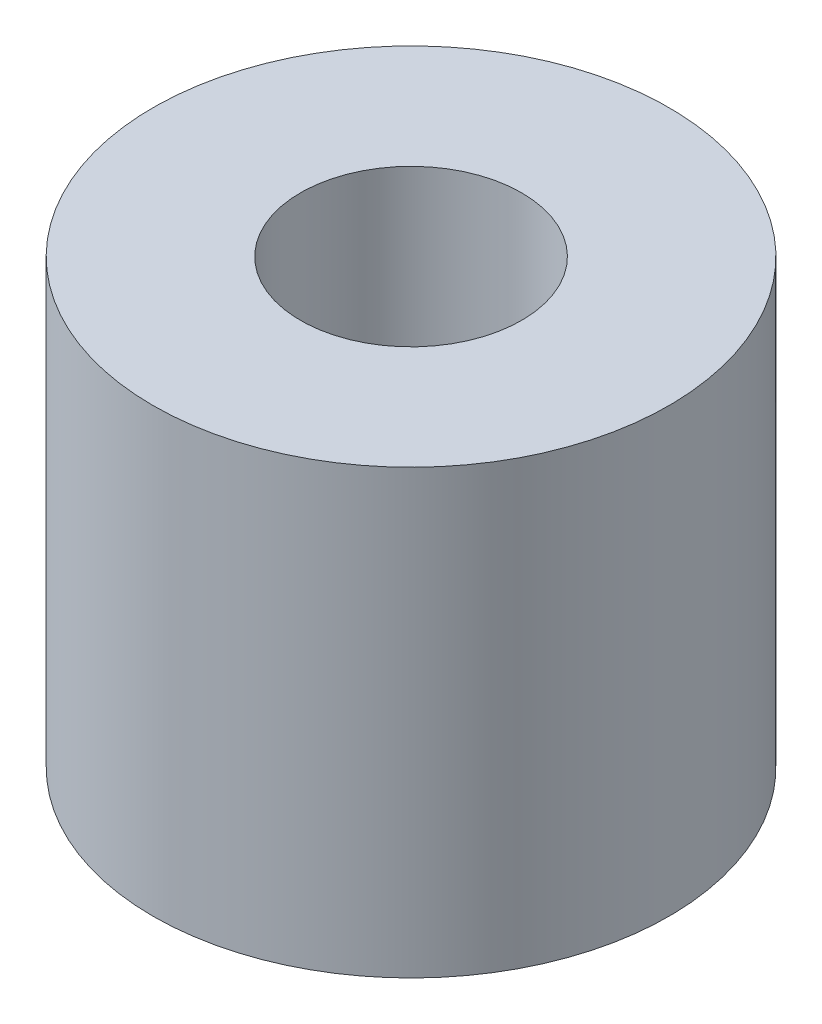
ISO-10303-21;
HEADER;
FILE_DESCRIPTION(('STEP AP214'),'2;1');
FILE_NAME('part.step','',(''),(''),'','','');
FILE_SCHEMA(('AUTOMOTIVE_DESIGN { 1 0 10303 214 1 1 1 1 }'));
ENDSEC;
DATA;
#1=APPLICATION_CONTEXT('core data for automotive mechanical design processes');
#2=APPLICATION_PROTOCOL_DEFINITION('international standard','automotive_design',2000,#1);
#3=PRODUCT_CONTEXT('',#1,'mechanical');
#4=PRODUCT('Part','Part','',(#3));
#5=PRODUCT_RELATED_PRODUCT_CATEGORY('part','',(#4));
#6=PRODUCT_DEFINITION_FORMATION('','',#4);
#7=PRODUCT_DEFINITION_CONTEXT('part definition',#1,'design');
#8=PRODUCT_DEFINITION('design','',#6,#7);
#9=PRODUCT_DEFINITION_SHAPE('','',#8);
#10=(LENGTH_UNIT() NAMED_UNIT(*) SI_UNIT(.MILLI.,.METRE.));
#11=(NAMED_UNIT(*) PLANE_ANGLE_UNIT() SI_UNIT($,.RADIAN.));
#12=(NAMED_UNIT(*) SI_UNIT($,.STERADIAN.) SOLID_ANGLE_UNIT());
#13=UNCERTAINTY_MEASURE_WITH_UNIT(LENGTH_MEASURE(1.E-05),#10,'distance_accuracy_value','');
#14=(GEOMETRIC_REPRESENTATION_CONTEXT(3) GLOBAL_UNCERTAINTY_ASSIGNED_CONTEXT((#13)) GLOBAL_UNIT_ASSIGNED_CONTEXT((#10,
#11,#12)) REPRESENTATION_CONTEXT('',''));
#15=CARTESIAN_POINT('',(0.,0.,0.));
#16=DIRECTION('',(0.,0.,1.));
#17=DIRECTION('',(1.,0.,0.));
#18=AXIS2_PLACEMENT_3D('',#15,#16,#17);
#19=CARTESIAN_POINT('',(0.,30.,0.));
#20=DIRECTION('',(0.,-1.,0.));
#21=DIRECTION('',(0.,0.,-1.));
#22=AXIS2_PLACEMENT_3D('',#19,#20,#21);
#23=CYLINDRICAL_SURFACE('',#22,17.5);
#24=CARTESIAN_POINT('',(0.,30.,0.));
#25=DIRECTION('',(0.,1.,0.));
#26=DIRECTION('',(0.,0.,1.));
#27=AXIS2_PLACEMENT_3D('',#24,#25,#26);
#28=CIRCLE('',#27,17.5);
#29=CARTESIAN_POINT('',(0.,30.,17.5));
#30=VERTEX_POINT('',#29);
#31=EDGE_CURVE('E10',#30,#30,#28,.T.);
#32=ORIENTED_EDGE('',*,*,#31,.F.);
#33=EDGE_LOOP('',(#32));
#34=FACE_BOUND('',#33,.T.);
#35=CARTESIAN_POINT('',(0.,0.,0.));
#36=DIRECTION('',(0.,1.,0.));
#37=DIRECTION('',(0.,0.,1.));
#38=AXIS2_PLACEMENT_3D('',#35,#36,#37);
#39=CIRCLE('',#38,17.5);
#40=CARTESIAN_POINT('',(0.,0.,17.5));
#41=VERTEX_POINT('',#40);
#42=EDGE_CURVE('E40',#41,#41,#39,.T.);
#43=ORIENTED_EDGE('',*,*,#42,.T.);
#44=EDGE_LOOP('',(#43));
#45=FACE_BOUND('',#44,.T.);
#46=ADVANCED_FACE('F37',(#34,#45),#23,.T.);
#47=CARTESIAN_POINT('',(0.,30.,0.));
#48=DIRECTION('',(0.,1.,0.));
#49=DIRECTION('',(0.,0.,1.));
#50=AXIS2_PLACEMENT_3D('',#47,#48,#49);
#51=PLANE('',#50);
#52=CARTESIAN_POINT('',(0.,30.,0.));
#53=DIRECTION('',(0.,-1.,0.));
#54=DIRECTION('',(0.,0.,-1.));
#55=AXIS2_PLACEMENT_3D('',#52,#53,#54);
#56=CIRCLE('',#55,7.50000000000001);
#57=CARTESIAN_POINT('',(0.,30.,-7.50000000000001));
#58=VERTEX_POINT('',#57);
#59=EDGE_CURVE('E47',#58,#58,#56,.T.);
#60=ORIENTED_EDGE('',*,*,#59,.T.);
#61=EDGE_LOOP('',(#60));
#62=FACE_BOUND('',#61,.T.);
#63=ORIENTED_EDGE('',*,*,#31,.T.);
#64=EDGE_LOOP('',(#63));
#65=FACE_BOUND('',#64,.T.);
#66=ADVANCED_FACE('F55',(#62,#65),#51,.T.);
#67=CARTESIAN_POINT('',(0.,0.,0.));
#68=DIRECTION('',(0.,1.,0.));
#69=DIRECTION('',(0.,0.,1.));
#70=AXIS2_PLACEMENT_3D('',#67,#68,#69);
#71=PLANE('',#70);
#72=CARTESIAN_POINT('',(0.,0.,0.));
#73=DIRECTION('',(0.,-1.,0.));
#74=DIRECTION('',(0.,0.,-1.));
#75=AXIS2_PLACEMENT_3D('',#72,#73,#74);
#76=CIRCLE('',#75,7.50000000000001);
#77=CARTESIAN_POINT('',(0.,0.,-7.50000000000001));
#78=VERTEX_POINT('',#77);
#79=EDGE_CURVE('E49',#78,#78,#76,.T.);
#80=ORIENTED_EDGE('',*,*,#79,.F.);
#81=EDGE_LOOP('',(#80));
#82=FACE_BOUND('',#81,.T.);
#83=ORIENTED_EDGE('',*,*,#42,.F.);
#84=EDGE_LOOP('',(#83));
#85=FACE_BOUND('',#84,.T.);
#86=ADVANCED_FACE('F60',(#82,#85),#71,.F.);
#87=CARTESIAN_POINT('',(0.,30.,0.));
#88=DIRECTION('',(0.,-1.,0.));
#89=DIRECTION('',(0.,0.,-1.));
#90=AXIS2_PLACEMENT_3D('',#87,#88,#89);
#91=CYLINDRICAL_SURFACE('',#90,7.50000000000001);
#92=ORIENTED_EDGE('',*,*,#59,.F.);
#93=EDGE_LOOP('',(#92));
#94=FACE_BOUND('',#93,.T.);
#95=ORIENTED_EDGE('',*,*,#79,.T.);
#96=EDGE_LOOP('',(#95));
#97=FACE_BOUND('',#96,.T.);
#98=ADVANCED_FACE('F57',(#94,#97),#91,.F.);
#99=CLOSED_SHELL('',(#46,#66,#86,#98));
#100=MANIFOLD_SOLID_BREP('B2',#99);
#101=ADVANCED_BREP_SHAPE_REPRESENTATION('',(#18,#100),#14);
#102=SHAPE_DEFINITION_REPRESENTATION(#9,#101);
ENDSEC;
END-ISO-10303-21;
